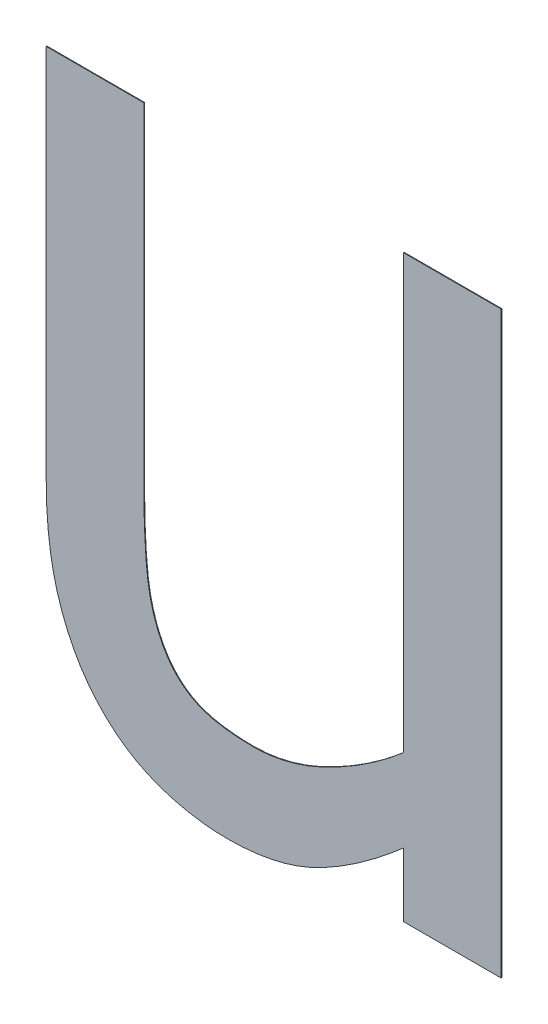
ISO-10303-21;
HEADER;
FILE_DESCRIPTION(('STEP AP214'),'2;1');
FILE_NAME('part.step','',(''),(''),'','','');
FILE_SCHEMA(('AUTOMOTIVE_DESIGN { 1 0 10303 214 1 1 1 1 }'));
ENDSEC;
DATA;
#1=APPLICATION_CONTEXT('core data for automotive mechanical design processes');
#2=APPLICATION_PROTOCOL_DEFINITION('international standard','automotive_design',2000,#1);
#3=PRODUCT_CONTEXT('',#1,'mechanical');
#4=PRODUCT('Part','Part','',(#3));
#5=PRODUCT_RELATED_PRODUCT_CATEGORY('part','',(#4));
#6=PRODUCT_DEFINITION_FORMATION('','',#4);
#7=PRODUCT_DEFINITION_CONTEXT('part definition',#1,'design');
#8=PRODUCT_DEFINITION('design','',#6,#7);
#9=PRODUCT_DEFINITION_SHAPE('','',#8);
#10=(LENGTH_UNIT() NAMED_UNIT(*) SI_UNIT(.MILLI.,.METRE.));
#11=(NAMED_UNIT(*) PLANE_ANGLE_UNIT() SI_UNIT($,.RADIAN.));
#12=(NAMED_UNIT(*) SI_UNIT($,.STERADIAN.) SOLID_ANGLE_UNIT());
#13=UNCERTAINTY_MEASURE_WITH_UNIT(LENGTH_MEASURE(1.E-05),#10,'distance_accuracy_value','');
#14=(GEOMETRIC_REPRESENTATION_CONTEXT(3) GLOBAL_UNCERTAINTY_ASSIGNED_CONTEXT((#13)) GLOBAL_UNIT_ASSIGNED_CONTEXT((#10,
#11,#12)) REPRESENTATION_CONTEXT('',''));
#15=CARTESIAN_POINT('',(0.,0.,0.));
#16=DIRECTION('',(0.,0.,1.));
#17=DIRECTION('',(1.,0.,0.));
#18=AXIS2_PLACEMENT_3D('',#15,#16,#17);
#19=CARTESIAN_POINT('',(-5.79047678036853,4.68413659368605,0.));
#20=DIRECTION('',(-1.,0.,0.));
#21=DIRECTION('',(0.,0.,1.));
#22=AXIS2_PLACEMENT_3D('',#19,#20,#21);
#23=PLANE('',#22);
#24=DIRECTION('',(0.,1.,0.));
#25=VECTOR('',#24,1.);
#26=CARTESIAN_POINT('',(-5.79047678036853,4.63764145522955,0.));
#27=LINE('',#26,#25);
#28=CARTESIAN_POINT('',(-5.79047678036853,4.63764145522955,0.));
#29=VERTEX_POINT('',#28);
#30=CARTESIAN_POINT('',(-5.79047678036853,4.73063173214255,0.));
#31=VERTEX_POINT('',#30);
#32=EDGE_CURVE('E11',#29,#31,#27,.T.);
#33=ORIENTED_EDGE('',*,*,#32,.F.);
#34=DIRECTION('',(0.,0.,1.));
#35=VECTOR('',#34,1.);
#36=CARTESIAN_POINT('',(-5.79047678036853,4.63764145522955,0.));
#37=LINE('',#36,#35);
#38=CARTESIAN_POINT('',(-5.79047678036853,4.63764145522955,0.001));
#39=VERTEX_POINT('',#38);
#40=EDGE_CURVE('E24',#29,#39,#37,.T.);
#41=ORIENTED_EDGE('',*,*,#40,.T.);
#42=DIRECTION('',(0.,-1.,0.));
#43=VECTOR('',#42,1.);
#44=CARTESIAN_POINT('',(-5.79047678036853,4.73063173214255,0.001));
#45=LINE('',#44,#43);
#46=CARTESIAN_POINT('',(-5.79047678036853,4.73063173214255,0.001));
#47=VERTEX_POINT('',#46);
#48=EDGE_CURVE('E136',#47,#39,#45,.T.);
#49=ORIENTED_EDGE('',*,*,#48,.F.);
#50=DIRECTION('',(0.,0.,1.));
#51=VECTOR('',#50,1.);
#52=CARTESIAN_POINT('',(-5.79047678036853,4.73063173214255,0.));
#53=LINE('',#52,#51);
#54=EDGE_CURVE('E282',#31,#47,#53,.T.);
#55=ORIENTED_EDGE('',*,*,#54,.F.);
#56=EDGE_LOOP('',(#33,#41,#49,#55));
#57=FACE_BOUND('',#56,.T.);
#58=ADVANCED_FACE('F17',(#57),#23,.T.);
#59=CARTESIAN_POINT('',(-6.04665587656953,4.61393805131105,0.));
#60=CARTESIAN_POINT('',(-6.04665587656953,4.61393805131105,0.000333333333333333));
#61=CARTESIAN_POINT('',(-6.04665587656953,4.61393805131105,0.000666666666666667));
#62=CARTESIAN_POINT('',(-6.04665587656953,4.61393805131105,0.001));
#63=CARTESIAN_POINT('',(-5.99803350955653,4.61393805131105,0.));
#64=CARTESIAN_POINT('',(-5.99803350955653,4.61393805131105,0.000333333333333333));
#65=CARTESIAN_POINT('',(-5.99803350955653,4.61393805131105,0.000666666666666667));
#66=CARTESIAN_POINT('',(-5.99803350955653,4.61393805131105,0.001));
#67=CARTESIAN_POINT('',(-5.95412143434777,4.62381446961054,0.));
#68=CARTESIAN_POINT('',(-5.95412143434777,4.62381446961054,0.000333333333333333));
#69=CARTESIAN_POINT('',(-5.95412143434777,4.62381446961054,0.000666666666666667));
#70=CARTESIAN_POINT('',(-5.95412143434777,4.62381446961054,0.001));
#71=CARTESIAN_POINT('',(-5.87571786753878,4.66332014280855,0.));
#72=CARTESIAN_POINT('',(-5.87571786753878,4.66332014280855,0.000333333333333333));
#73=CARTESIAN_POINT('',(-5.87571786753878,4.66332014280855,0.000666666666666667));
#74=CARTESIAN_POINT('',(-5.87571786753878,4.66332014280855,0.001));
#75=CARTESIAN_POINT('',(-5.83423691068053,4.69234161811955,0.));
#76=CARTESIAN_POINT('',(-5.83423691068053,4.69234161811955,0.000333333333333333));
#77=CARTESIAN_POINT('',(-5.83423691068053,4.69234161811955,0.000666666666666667));
#78=CARTESIAN_POINT('',(-5.83423691068053,4.69234161811955,0.001));
#79=CARTESIAN_POINT('',(-5.79047678036853,4.73063173214255,0.));
#80=CARTESIAN_POINT('',(-5.79047678036853,4.73063173214255,0.000333333333333333));
#81=CARTESIAN_POINT('',(-5.79047678036853,4.73063173214255,0.000666666666666667));
#82=CARTESIAN_POINT('',(-5.79047678036853,4.73063173214255,0.001));
#83=B_SPLINE_SURFACE_WITH_KNOTS('',3,3,((#59,#60,#61,#62),(#63,#64,#65,#66),(#67,#68,#69,#70),
(#71,#72,#73,#74),(#75,#76,#77,#78),(#79,#80,#81,#82)),.UNSPECIFIED.,.F.,.F.,.F.,(4,2,4),(4,4),
(-2.,-1.,0.),(0.,0.0001),.UNSPECIFIED.);
#84=CARTESIAN_POINT('',(-5.79047678036853,4.73063173214255,0.));
#85=CARTESIAN_POINT('',(-5.85611697583653,4.67319656110805,0.));
#86=CARTESIAN_POINT('',(-5.97372232605003,4.61393805131105,0.));
#87=CARTESIAN_POINT('',(-6.04665587656953,4.61393805131105,0.));
#88=B_SPLINE_CURVE_WITH_KNOTS('',2,(#84,#85,#86,#87),.UNSPECIFIED.,.F.,.F.,(3,1,3),(0.,1.,2.),.UNSPECIFIED.);
#89=CARTESIAN_POINT('',(-6.04665587656953,4.61393805131105,0.));
#90=VERTEX_POINT('',#89);
#91=EDGE_CURVE('E275',#31,#90,#88,.T.);
#92=CARTESIAN_POINT('',(-6.04665587656953,4.61393805131105,0.001));
#93=CARTESIAN_POINT('',(-5.97372232605003,4.61393805131105,0.001));
#94=CARTESIAN_POINT('',(-5.85611697583653,4.67319656110805,0.001));
#95=CARTESIAN_POINT('',(-5.79047678036853,4.73063173214255,0.001));
#96=B_SPLINE_CURVE_WITH_KNOTS('',2,(#92,#93,#94,#95),.UNSPECIFIED.,.F.,.F.,(3,1,3),(-2.,-1.,0.),.UNSPECIFIED.);
#97=CARTESIAN_POINT('',(-6.04665587656953,4.61393805131105,0.001));
#98=VERTEX_POINT('',#97);
#99=EDGE_CURVE('E271',#98,#47,#96,.T.);
#100=DIRECTION('',(0.,0.,1.));
#101=VECTOR('',#100,1.);
#102=CARTESIAN_POINT('',(-6.04665587656953,4.61393805131105,0.));
#103=LINE('',#102,#101);
#104=EDGE_CURVE('E265',#90,#98,#103,.T.);
#105=ORIENTED_EDGE('',*,*,#91,.F.);
#106=ORIENTED_EDGE('',*,*,#54,.T.);
#107=ORIENTED_EDGE('',*,*,#99,.F.);
#108=ORIENTED_EDGE('',*,*,#104,.F.);
#109=EDGE_LOOP('',(#105,#106,#107,#108));
#110=FACE_BOUND('',#109,.T.);
#111=ADVANCED_FACE('F331',(#110),#83,.T.);
#112=CARTESIAN_POINT('',(-6.2344597691568,4.68960660997505,0.));
#113=CARTESIAN_POINT('',(-6.2344597691568,4.68960660997505,0.000333333333333333));
#114=CARTESIAN_POINT('',(-6.2344597691568,4.68960660997505,0.000666666666666667));
#115=CARTESIAN_POINT('',(-6.2344597691568,4.68960660997505,0.001));
#116=CARTESIAN_POINT('',(-6.21075636523795,4.66347208770505,0.));
#117=CARTESIAN_POINT('',(-6.21075636523795,4.66347208770505,0.000333333333333333));
#118=CARTESIAN_POINT('',(-6.21075636523795,4.66347208770505,0.000666666666666667));
#119=CARTESIAN_POINT('',(-6.21075636523795,4.66347208770505,0.001));
#120=CARTESIAN_POINT('',(-6.18264655930845,4.64432703069355,0.));
#121=CARTESIAN_POINT('',(-6.18264655930845,4.64432703069355,0.000333333333333333));
#122=CARTESIAN_POINT('',(-6.18264655930845,4.64432703069355,0.000666666666666667));
#123=CARTESIAN_POINT('',(-6.18264655930845,4.64432703069355,0.001));
#124=CARTESIAN_POINT('',(-6.11761414342811,4.62001584718754,0.));
#125=CARTESIAN_POINT('',(-6.11761414342811,4.62001584718754,0.000333333333333333));
#126=CARTESIAN_POINT('',(-6.11761414342811,4.62001584718754,0.000666666666666666));
#127=CARTESIAN_POINT('',(-6.11761414342811,4.62001584718754,0.001));
#128=CARTESIAN_POINT('',(-6.08312265182853,4.61393805131105,0.));
#129=CARTESIAN_POINT('',(-6.08312265182853,4.61393805131105,0.000333333333333333));
#130=CARTESIAN_POINT('',(-6.08312265182853,4.61393805131105,0.000666666666666667));
#131=CARTESIAN_POINT('',(-6.08312265182853,4.61393805131105,0.001));
#132=CARTESIAN_POINT('',(-6.04665587656953,4.61393805131105,0.));
#133=CARTESIAN_POINT('',(-6.04665587656953,4.61393805131105,0.000333333333333333));
#134=CARTESIAN_POINT('',(-6.04665587656953,4.61393805131105,0.000666666666666667));
#135=CARTESIAN_POINT('',(-6.04665587656953,4.61393805131105,0.001));
#136=B_SPLINE_SURFACE_WITH_KNOTS('',3,3,((#112,#113,#114,#115),(#116,#117,#118,#119),(#120,#121,
#122,#123),(#124,#125,#126,#127),(#128,#129,#130,#131),(#132,#133,#134,#135)),.UNSPECIFIED.,.F.,
.F.,.F.,(4,2,4),(4,4),(-2.,-1.,0.),(0.,0.0001),.UNSPECIFIED.);
#137=CARTESIAN_POINT('',(-6.04665587656953,4.61393805131105,0.));
#138=CARTESIAN_POINT('',(-6.10135603945803,4.61393805131105,0.));
#139=CARTESIAN_POINT('',(-6.19890466327852,4.65040482657005,0.));
#140=CARTESIAN_POINT('',(-6.2344597691568,4.68960660997505,0.));
#141=B_SPLINE_CURVE_WITH_KNOTS('',2,(#137,#138,#139,#140),.UNSPECIFIED.,.F.,.F.,(3,1,3),(0.,1.,
2.),.UNSPECIFIED.);
#142=CARTESIAN_POINT('',(-6.2344597691568,4.68960660997505,0.));
#143=VERTEX_POINT('',#142);
#144=EDGE_CURVE('E258',#90,#143,#141,.T.);
#145=CARTESIAN_POINT('',(-6.2344597691568,4.68960660997505,0.001));
#146=CARTESIAN_POINT('',(-6.19890466327852,4.65040482657005,0.001));
#147=CARTESIAN_POINT('',(-6.10135603945803,4.61393805131105,0.001));
#148=CARTESIAN_POINT('',(-6.04665587656953,4.61393805131105,0.001));
#149=B_SPLINE_CURVE_WITH_KNOTS('',2,(#145,#146,#147,#148),.UNSPECIFIED.,.F.,.F.,(3,1,3),(-2.,
-1.,0.),.UNSPECIFIED.);
#150=CARTESIAN_POINT('',(-6.2344597691568,4.68960660997505,0.001));
#151=VERTEX_POINT('',#150);
#152=EDGE_CURVE('E253',#151,#98,#149,.T.);
#153=DIRECTION('',(0.,0.,1.));
#154=VECTOR('',#153,1.);
#155=CARTESIAN_POINT('',(-6.2344597691568,4.68960660997505,0.));
#156=LINE('',#155,#154);
#157=EDGE_CURVE('E247',#143,#151,#156,.T.);
#158=ORIENTED_EDGE('',*,*,#144,.F.);
#159=ORIENTED_EDGE('',*,*,#104,.T.);
#160=ORIENTED_EDGE('',*,*,#152,.F.);
#161=ORIENTED_EDGE('',*,*,#157,.F.);
#162=EDGE_LOOP('',(#158,#159,#160,#161));
#163=FACE_BOUND('',#162,.T.);
#164=ADVANCED_FACE('F327',(#163),#136,.T.);
#165=CARTESIAN_POINT('',(-6.3110399972023,4.93393400421516,0.));
#166=CARTESIAN_POINT('',(-6.3110399972023,4.93393400421516,0.000333333333333333));
#167=CARTESIAN_POINT('',(-6.3110399972023,4.93393400421516,0.000666666666666667));
#168=CARTESIAN_POINT('',(-6.3110399972023,4.93393400421516,0.001));
#169=CARTESIAN_POINT('',(-6.3110399972023,4.87680272297475,0.));
#170=CARTESIAN_POINT('',(-6.3110399972023,4.87680272297475,0.000333333333333333));
#171=CARTESIAN_POINT('',(-6.3110399972023,4.87680272297475,0.000666666666666667));
#172=CARTESIAN_POINT('',(-6.3110399972023,4.87680272297475,0.001));
#173=CARTESIAN_POINT('',(-6.30435442173801,4.82833230085854,0.));
#174=CARTESIAN_POINT('',(-6.30435442173801,4.82833230085854,0.000333333333333333));
#175=CARTESIAN_POINT('',(-6.30435442173801,4.82833230085854,0.000666666666666667));
#176=CARTESIAN_POINT('',(-6.30435442173801,4.82833230085854,0.001));
#177=CARTESIAN_POINT('',(-6.27761211988085,4.74871317487455,0.));
#178=CARTESIAN_POINT('',(-6.27761211988085,4.74871317487455,0.000333333333333333));
#179=CARTESIAN_POINT('',(-6.27761211988085,4.74871317487455,0.000666666666666667));
#180=CARTESIAN_POINT('',(-6.27761211988085,4.74871317487455,0.001));
#181=CARTESIAN_POINT('',(-6.25877095266331,4.71574113224405,0.));
#182=CARTESIAN_POINT('',(-6.25877095266331,4.71574113224405,0.000333333333333333));
#183=CARTESIAN_POINT('',(-6.25877095266331,4.71574113224405,0.000666666666666667));
#184=CARTESIAN_POINT('',(-6.25877095266331,4.71574113224405,0.001));
#185=CARTESIAN_POINT('',(-6.2344597691568,4.68960660997505,0.));
#186=CARTESIAN_POINT('',(-6.2344597691568,4.68960660997505,0.000333333333333333));
#187=CARTESIAN_POINT('',(-6.2344597691568,4.68960660997505,0.000666666666666667));
#188=CARTESIAN_POINT('',(-6.2344597691568,4.68960660997505,0.001));
#189=B_SPLINE_SURFACE_WITH_KNOTS('',3,3,((#165,#166,#167,#168),(#169,#170,#171,#172),(#173,#174,
#175,#176),(#177,#178,#179,#180),(#181,#182,#183,#184),(#185,#186,#187,#188)),.UNSPECIFIED.,.F.,
.F.,.F.,(4,2,4),(4,4),(-2.,-1.,0.),(0.,0.0001),.UNSPECIFIED.);
#190=CARTESIAN_POINT('',(-6.2344597691568,4.68960660997505,0.));
#191=CARTESIAN_POINT('',(-6.27092654441656,4.72880839337855,0.));
#192=CARTESIAN_POINT('',(-6.3110399972023,4.84823708235455,0.));
#193=CARTESIAN_POINT('',(-6.3110399972023,4.93393400421516,0.));
#194=B_SPLINE_CURVE_WITH_KNOTS('',2,(#190,#191,#192,#193),.UNSPECIFIED.,.F.,.F.,(3,1,3),(0.,1.,
2.),.UNSPECIFIED.);
#195=CARTESIAN_POINT('',(-6.3110399972023,4.93393400421516,0.));
#196=VERTEX_POINT('',#195);
#197=EDGE_CURVE('E240',#143,#196,#194,.T.);
#198=CARTESIAN_POINT('',(-6.3110399972023,4.93393400421516,0.001));
#199=CARTESIAN_POINT('',(-6.3110399972023,4.84823708235455,0.001));
#200=CARTESIAN_POINT('',(-6.27092654441656,4.72880839337855,0.001));
#201=CARTESIAN_POINT('',(-6.2344597691568,4.68960660997505,0.001));
#202=B_SPLINE_CURVE_WITH_KNOTS('',2,(#198,#199,#200,#201),.UNSPECIFIED.,.F.,.F.,(3,1,3),(-2.,
-1.,0.),.UNSPECIFIED.);
#203=CARTESIAN_POINT('',(-6.3110399972023,4.93393400421516,0.001));
#204=VERTEX_POINT('',#203);
#205=EDGE_CURVE('E235',#204,#151,#202,.T.);
#206=DIRECTION('',(0.,0.,1.));
#207=VECTOR('',#206,1.);
#208=CARTESIAN_POINT('',(-6.3110399972023,4.93393400421516,0.));
#209=LINE('',#208,#207);
#210=EDGE_CURVE('E232',#196,#204,#209,.T.);
#211=ORIENTED_EDGE('',*,*,#197,.F.);
#212=ORIENTED_EDGE('',*,*,#157,.T.);
#213=ORIENTED_EDGE('',*,*,#205,.F.);
#214=ORIENTED_EDGE('',*,*,#210,.F.);
#215=EDGE_LOOP('',(#211,#212,#213,#214));
#216=FACE_BOUND('',#215,.T.);
#217=ADVANCED_FACE('F323',(#216),#189,.T.);
#218=CARTESIAN_POINT('',(-6.3110399972023,5.20789065335435,0.));
#219=DIRECTION('',(-1.,0.,0.));
#220=DIRECTION('',(0.,0.,1.));
#221=AXIS2_PLACEMENT_3D('',#218,#219,#220);
#222=PLANE('',#221);
#223=DIRECTION('',(0.,1.,0.));
#224=VECTOR('',#223,1.);
#225=CARTESIAN_POINT('',(-6.3110399972023,4.93393400421516,0.));
#226=LINE('',#225,#224);
#227=CARTESIAN_POINT('',(-6.3110399972023,5.48184730249355,0.));
#228=VERTEX_POINT('',#227);
#229=EDGE_CURVE('E230',#196,#228,#226,.T.);
#230=ORIENTED_EDGE('',*,*,#229,.F.);
#231=ORIENTED_EDGE('',*,*,#210,.T.);
#232=DIRECTION('',(0.,-1.,0.));
#233=VECTOR('',#232,1.);
#234=CARTESIAN_POINT('',(-6.3110399972023,5.48184730249355,0.001));
#235=LINE('',#234,#233);
#236=CARTESIAN_POINT('',(-6.3110399972023,5.48184730249355,0.001));
#237=VERTEX_POINT('',#236);
#238=EDGE_CURVE('E227',#237,#204,#235,.T.);
#239=ORIENTED_EDGE('',*,*,#238,.F.);
#240=DIRECTION('',(0.,0.,1.));
#241=VECTOR('',#240,1.);
#242=CARTESIAN_POINT('',(-6.3110399972023,5.48184730249355,0.));
#243=LINE('',#242,#241);
#244=EDGE_CURVE('E224',#228,#237,#243,.T.);
#245=ORIENTED_EDGE('',*,*,#244,.F.);
#246=EDGE_LOOP('',(#230,#231,#239,#245));
#247=FACE_BOUND('',#246,.T.);
#248=ADVANCED_FACE('F319',(#247),#222,.T.);
#249=CARTESIAN_POINT('',(-6.23992978544576,5.48184730249355,0.));
#250=DIRECTION('',(0.,1.,0.));
#251=DIRECTION('',(0.,0.,1.));
#252=AXIS2_PLACEMENT_3D('',#249,#250,#251);
#253=PLANE('',#252);
#254=DIRECTION('',(1.,0.,0.));
#255=VECTOR('',#254,1.);
#256=CARTESIAN_POINT('',(-6.3110399972023,5.48184730249355,0.));
#257=LINE('',#256,#255);
#258=CARTESIAN_POINT('',(-6.16881957368922,5.48184730249355,0.));
#259=VERTEX_POINT('',#258);
#260=EDGE_CURVE('E222',#228,#259,#257,.T.);
#261=ORIENTED_EDGE('',*,*,#260,.F.);
#262=ORIENTED_EDGE('',*,*,#244,.T.);
#263=DIRECTION('',(-1.,0.,0.));
#264=VECTOR('',#263,1.);
#265=CARTESIAN_POINT('',(-6.16881957368922,5.48184730249355,0.001));
#266=LINE('',#265,#264);
#267=CARTESIAN_POINT('',(-6.16881957368922,5.48184730249355,0.001));
#268=VERTEX_POINT('',#267);
#269=EDGE_CURVE('E219',#268,#237,#266,.T.);
#270=ORIENTED_EDGE('',*,*,#269,.F.);
#271=DIRECTION('',(0.,0.,1.));
#272=VECTOR('',#271,1.);
#273=CARTESIAN_POINT('',(-6.16881957368922,5.48184730249355,0.));
#274=LINE('',#273,#272);
#275=EDGE_CURVE('E216',#259,#268,#274,.T.);
#276=ORIENTED_EDGE('',*,*,#275,.F.);
#277=EDGE_LOOP('',(#261,#262,#270,#276));
#278=FACE_BOUND('',#277,.T.);
#279=ADVANCED_FACE('F315',(#278),#253,.T.);
#280=CARTESIAN_POINT('',(-6.16881957368922,5.24116658577889,0.));
#281=DIRECTION('',(1.,0.,0.));
#282=DIRECTION('',(0.,0.,-1.));
#283=AXIS2_PLACEMENT_3D('',#280,#281,#282);
#284=PLANE('',#283);
#285=DIRECTION('',(0.,-1.,0.));
#286=VECTOR('',#285,1.);
#287=CARTESIAN_POINT('',(-6.16881957368922,5.48184730249355,0.));
#288=LINE('',#287,#286);
#289=CARTESIAN_POINT('',(-6.16881957368922,5.00048586906423,0.));
#290=VERTEX_POINT('',#289);
#291=EDGE_CURVE('E214',#259,#290,#288,.T.);
#292=ORIENTED_EDGE('',*,*,#291,.F.);
#293=ORIENTED_EDGE('',*,*,#275,.T.);
#294=DIRECTION('',(0.,1.,0.));
#295=VECTOR('',#294,1.);
#296=CARTESIAN_POINT('',(-6.16881957368922,5.00048586906423,0.001));
#297=LINE('',#296,#295);
#298=CARTESIAN_POINT('',(-6.16881957368922,5.00048586906423,0.001));
#299=VERTEX_POINT('',#298);
#300=EDGE_CURVE('E211',#299,#268,#297,.T.);
#301=ORIENTED_EDGE('',*,*,#300,.F.);
#302=DIRECTION('',(0.,0.,1.));
#303=VECTOR('',#302,1.);
#304=CARTESIAN_POINT('',(-6.16881957368922,5.00048586906423,0.));
#305=LINE('',#304,#303);
#306=EDGE_CURVE('E205',#290,#299,#305,.T.);
#307=ORIENTED_EDGE('',*,*,#306,.F.);
#308=EDGE_LOOP('',(#292,#293,#301,#307));
#309=FACE_BOUND('',#308,.T.);
#310=ADVANCED_FACE('F311',(#309),#284,.T.);
#311=CARTESIAN_POINT('',(-6.14146949224503,4.81177030709555,0.));
#312=CARTESIAN_POINT('',(-6.14146949224503,4.81177030709555,0.000333333333333333));
#313=CARTESIAN_POINT('',(-6.14146949224503,4.81177030709555,0.000666666666666667));
#314=CARTESIAN_POINT('',(-6.14146949224503,4.81177030709555,0.001));
#315=CARTESIAN_POINT('',(-6.15301730441003,4.83365037225055,0.));
#316=CARTESIAN_POINT('',(-6.15301730441003,4.83365037225055,0.000333333333333333));
#317=CARTESIAN_POINT('',(-6.15301730441003,4.83365037225055,0.000666666666666667));
#318=CARTESIAN_POINT('',(-6.15301730441003,4.83365037225055,0.001));
#319=CARTESIAN_POINT('',(-6.16046260435864,4.85932905982898,0.));
#320=CARTESIAN_POINT('',(-6.16046260435864,4.85932905982898,0.000333333333333333));
#321=CARTESIAN_POINT('',(-6.16046260435864,4.85932905982898,0.000666666666666667));
#322=CARTESIAN_POINT('',(-6.16046260435864,4.85932905982898,0.001));
#323=CARTESIAN_POINT('',(-6.1671481798231,4.91828367983273,0.));
#324=CARTESIAN_POINT('',(-6.1671481798231,4.91828367983273,0.000333333333333333));
#325=CARTESIAN_POINT('',(-6.1671481798231,4.91828367983273,0.000666666666666667));
#326=CARTESIAN_POINT('',(-6.1671481798231,4.91828367983273,0.001));
#327=CARTESIAN_POINT('',(-6.16881957368922,4.95551017957719,0.));
#328=CARTESIAN_POINT('',(-6.16881957368922,4.95551017957719,0.000333333333333333));
#329=CARTESIAN_POINT('',(-6.16881957368922,4.95551017957719,0.000666666666666667));
#330=CARTESIAN_POINT('',(-6.16881957368922,4.95551017957719,0.001));
#331=CARTESIAN_POINT('',(-6.16881957368922,5.00048586906423,0.));
#332=CARTESIAN_POINT('',(-6.16881957368922,5.00048586906423,0.000333333333333333));
#333=CARTESIAN_POINT('',(-6.16881957368922,5.00048586906423,0.000666666666666667));
#334=CARTESIAN_POINT('',(-6.16881957368922,5.00048586906423,0.001));
#335=B_SPLINE_SURFACE_WITH_KNOTS('',3,3,((#311,#312,#313,#314),(#315,#316,#317,#318),(#319,#320,
#321,#322),(#323,#324,#325,#326),(#327,#328,#329,#330),(#331,#332,#333,#334)),.UNSPECIFIED.,.F.,
.F.,.F.,(4,2,4),(4,4),(-2.,-1.,0.),(0.,0.0001),.UNSPECIFIED.);
#336=CARTESIAN_POINT('',(-6.16881957368922,5.00048586906423,0.));
#337=CARTESIAN_POINT('',(-6.16881957368922,4.93302233483367,0.));
#338=CARTESIAN_POINT('',(-6.15879121049253,4.84459040482805,0.));
#339=CARTESIAN_POINT('',(-6.14146949224503,4.81177030709555,0.));
#340=B_SPLINE_CURVE_WITH_KNOTS('',2,(#336,#337,#338,#339),.UNSPECIFIED.,.F.,.F.,(3,1,3),(0.,1.,
2.),.UNSPECIFIED.);
#341=CARTESIAN_POINT('',(-6.14146949224503,4.81177030709555,0.));
#342=VERTEX_POINT('',#341);
#343=EDGE_CURVE('E198',#290,#342,#340,.T.);
#344=CARTESIAN_POINT('',(-6.14146949224503,4.81177030709555,0.001));
#345=CARTESIAN_POINT('',(-6.15879121049253,4.84459040482805,0.001));
#346=CARTESIAN_POINT('',(-6.16881957368922,4.93302233483367,0.001));
#347=CARTESIAN_POINT('',(-6.16881957368922,5.00048586906423,0.001));
#348=B_SPLINE_CURVE_WITH_KNOTS('',2,(#344,#345,#346,#347),.UNSPECIFIED.,.F.,.F.,(3,1,3),(-2.,
-1.,0.),.UNSPECIFIED.);
#349=CARTESIAN_POINT('',(-6.14146949224503,4.81177030709555,0.001));
#350=VERTEX_POINT('',#349);
#351=EDGE_CURVE('E193',#350,#299,#348,.T.);
#352=DIRECTION('',(0.,0.,1.));
#353=VECTOR('',#352,1.);
#354=CARTESIAN_POINT('',(-6.14146949224503,4.81177030709555,0.));
#355=LINE('',#354,#353);
#356=EDGE_CURVE('E187',#342,#350,#355,.T.);
#357=ORIENTED_EDGE('',*,*,#343,.F.);
#358=ORIENTED_EDGE('',*,*,#306,.T.);
#359=ORIENTED_EDGE('',*,*,#351,.F.);
#360=ORIENTED_EDGE('',*,*,#356,.F.);
#361=EDGE_LOOP('',(#357,#358,#359,#360));
#362=FACE_BOUND('',#361,.T.);
#363=ADVANCED_FACE('F307',(#362),#335,.T.);
#364=CARTESIAN_POINT('',(-6.00927743192703,4.74886511977205,0.));
#365=CARTESIAN_POINT('',(-6.00927743192703,4.74886511977205,0.000333333333333333));
#366=CARTESIAN_POINT('',(-6.00927743192703,4.74886511977205,0.000666666666666667));
#367=CARTESIAN_POINT('',(-6.00927743192703,4.74886511977205,0.001));
#368=CARTESIAN_POINT('',(-6.04635198677503,4.74886511977205,0.));
#369=CARTESIAN_POINT('',(-6.04635198677503,4.74886511977205,0.000333333333333333));
#370=CARTESIAN_POINT('',(-6.04635198677503,4.74886511977205,0.000666666666666667));
#371=CARTESIAN_POINT('',(-6.04635198677503,4.74886511977205,0.001));
#372=CARTESIAN_POINT('',(-6.07476568249853,4.7538793013703,0.));
#373=CARTESIAN_POINT('',(-6.07476568249853,4.7538793013703,0.000333333333333333));
#374=CARTESIAN_POINT('',(-6.07476568249853,4.7538793013703,0.000666666666666667));
#375=CARTESIAN_POINT('',(-6.07476568249853,4.7538793013703,0.001));
#376=CARTESIAN_POINT('',(-6.11427135569653,4.7739360277633,0.));
#377=CARTESIAN_POINT('',(-6.11427135569653,4.7739360277633,0.000333333333333333));
#378=CARTESIAN_POINT('',(-6.11427135569653,4.7739360277633,0.000666666666666667));
#379=CARTESIAN_POINT('',(-6.11427135569653,4.7739360277633,0.001));
#380=CARTESIAN_POINT('',(-6.12992168007903,4.78989024193955,0.));
#381=CARTESIAN_POINT('',(-6.12992168007903,4.78989024193955,0.000333333333333333));
#382=CARTESIAN_POINT('',(-6.12992168007903,4.78989024193955,0.000666666666666667));
#383=CARTESIAN_POINT('',(-6.12992168007903,4.78989024193955,0.001));
#384=CARTESIAN_POINT('',(-6.14146949224503,4.81177030709555,0.));
#385=CARTESIAN_POINT('',(-6.14146949224503,4.81177030709555,0.000333333333333333));
#386=CARTESIAN_POINT('',(-6.14146949224503,4.81177030709555,0.000666666666666667));
#387=CARTESIAN_POINT('',(-6.14146949224503,4.81177030709555,0.001));
#388=B_SPLINE_SURFACE_WITH_KNOTS('',3,3,((#364,#365,#366,#367),(#368,#369,#370,#371),(#372,#373,
#374,#375),(#376,#377,#378,#379),(#380,#381,#382,#383),(#384,#385,#386,#387)),.UNSPECIFIED.,.F.,
.F.,.F.,(4,2,4),(4,4),(-2.,-1.,0.),(0.,0.0001),.UNSPECIFIED.);
#389=CARTESIAN_POINT('',(-6.14146949224503,4.81177030709555,0.));
#390=CARTESIAN_POINT('',(-6.12414777399603,4.77895020936155,0.));
#391=CARTESIAN_POINT('',(-6.06488926419903,4.74886511977205,0.));
#392=CARTESIAN_POINT('',(-6.00927743192703,4.74886511977205,0.));
#393=B_SPLINE_CURVE_WITH_KNOTS('',2,(#389,#390,#391,#392),.UNSPECIFIED.,.F.,.F.,(3,1,3),(0.,1.,
2.),.UNSPECIFIED.);
#394=CARTESIAN_POINT('',(-6.00927743192703,4.74886511977205,0.));
#395=VERTEX_POINT('',#394);
#396=EDGE_CURVE('E180',#342,#395,#393,.T.);
#397=CARTESIAN_POINT('',(-6.00927743192703,4.74886511977205,0.001));
#398=CARTESIAN_POINT('',(-6.06488926419903,4.74886511977205,0.001));
#399=CARTESIAN_POINT('',(-6.12414777399603,4.77895020936155,0.001));
#400=CARTESIAN_POINT('',(-6.14146949224503,4.81177030709555,0.001));
#401=B_SPLINE_CURVE_WITH_KNOTS('',2,(#397,#398,#399,#400),.UNSPECIFIED.,.F.,.F.,(3,1,3),(-2.,
-1.,0.),.UNSPECIFIED.);
#402=CARTESIAN_POINT('',(-6.00927743192703,4.74886511977205,0.001));
#403=VERTEX_POINT('',#402);
#404=EDGE_CURVE('E175',#403,#350,#401,.T.);
#405=DIRECTION('',(0.,0.,1.));
#406=VECTOR('',#405,1.);
#407=CARTESIAN_POINT('',(-6.00927743192703,4.74886511977205,0.));
#408=LINE('',#407,#406);
#409=EDGE_CURVE('E169',#395,#403,#408,.T.);
#410=ORIENTED_EDGE('',*,*,#396,.F.);
#411=ORIENTED_EDGE('',*,*,#356,.T.);
#412=ORIENTED_EDGE('',*,*,#404,.F.);
#413=ORIENTED_EDGE('',*,*,#409,.F.);
#414=EDGE_LOOP('',(#410,#411,#412,#413));
#415=FACE_BOUND('',#414,.T.);
#416=ADVANCED_FACE('F303',(#415),#388,.T.);
#417=CARTESIAN_POINT('',(-5.79047678036853,4.85097209049905,0.));
#418=CARTESIAN_POINT('',(-5.79047678036853,4.85097209049905,0.000333333333333333));
#419=CARTESIAN_POINT('',(-5.79047678036853,4.85097209049905,0.000666666666666667));
#420=CARTESIAN_POINT('',(-5.79047678036853,4.85097209049905,0.001));
#421=CARTESIAN_POINT('',(-5.82329687810253,4.82240644987905,0.));
#422=CARTESIAN_POINT('',(-5.82329687810253,4.82240644987905,0.000333333333333333));
#423=CARTESIAN_POINT('',(-5.82329687810253,4.82240644987905,0.000666666666666667));
#424=CARTESIAN_POINT('',(-5.82329687810253,4.82240644987905,0.001));
#425=CARTESIAN_POINT('',(-5.85930781867178,4.79824721126954,0.));
#426=CARTESIAN_POINT('',(-5.85930781867178,4.79824721126954,0.000333333333333333));
#427=CARTESIAN_POINT('',(-5.85930781867178,4.79824721126954,0.000666666666666667));
#428=CARTESIAN_POINT('',(-5.85930781867178,4.79824721126954,0.001));
#429=CARTESIAN_POINT('',(-5.93771138548078,4.75874153807155,0.));
#430=CARTESIAN_POINT('',(-5.93771138548078,4.75874153807155,0.000333333333333333));
#431=CARTESIAN_POINT('',(-5.93771138548078,4.75874153807155,0.000666666666666667));
#432=CARTESIAN_POINT('',(-5.93771138548078,4.75874153807155,0.001));
#433=CARTESIAN_POINT('',(-5.97463399543103,4.74886511977205,0.));
#434=CARTESIAN_POINT('',(-5.97463399543103,4.74886511977205,0.000333333333333333));
#435=CARTESIAN_POINT('',(-5.97463399543103,4.74886511977205,0.000666666666666667));
#436=CARTESIAN_POINT('',(-5.97463399543103,4.74886511977205,0.001));
#437=CARTESIAN_POINT('',(-6.00927743192703,4.74886511977205,0.));
#438=CARTESIAN_POINT('',(-6.00927743192703,4.74886511977205,0.000333333333333333));
#439=CARTESIAN_POINT('',(-6.00927743192703,4.74886511977205,0.000666666666666667));
#440=CARTESIAN_POINT('',(-6.00927743192703,4.74886511977205,0.001));
#441=B_SPLINE_SURFACE_WITH_KNOTS('',3,3,((#417,#418,#419,#420),(#421,#422,#423,#424),(#425,#426,
#427,#428),(#429,#430,#431,#432),(#433,#434,#435,#436),(#437,#438,#439,#440)),.UNSPECIFIED.,.F.,
.F.,.F.,(4,2,4),(4,4),(-2.,-1.,0.),(0.,0.0001),.UNSPECIFIED.);
#442=CARTESIAN_POINT('',(-6.00927743192703,4.74886511977205,0.));
#443=CARTESIAN_POINT('',(-5.95731227718303,4.74886511977205,0.));
#444=CARTESIAN_POINT('',(-5.83970692696953,4.80812362956905,0.));
#445=CARTESIAN_POINT('',(-5.79047678036853,4.85097209049905,0.));
#446=B_SPLINE_CURVE_WITH_KNOTS('',2,(#442,#443,#444,#445),.UNSPECIFIED.,.F.,.F.,(3,1,3),(0.,1.,
2.),.UNSPECIFIED.);
#447=CARTESIAN_POINT('',(-5.79047678036853,4.85097209049905,0.));
#448=VERTEX_POINT('',#447);
#449=EDGE_CURVE('E162',#395,#448,#446,.T.);
#450=CARTESIAN_POINT('',(-5.79047678036853,4.85097209049905,0.001));
#451=CARTESIAN_POINT('',(-5.83970692696953,4.80812362956905,0.001));
#452=CARTESIAN_POINT('',(-5.95731227718303,4.74886511977205,0.001));
#453=CARTESIAN_POINT('',(-6.00927743192703,4.74886511977205,0.001));
#454=B_SPLINE_CURVE_WITH_KNOTS('',2,(#450,#451,#452,#453),.UNSPECIFIED.,.F.,.F.,(3,1,3),(-2.,
-1.,0.),.UNSPECIFIED.);
#455=CARTESIAN_POINT('',(-5.79047678036853,4.85097209049905,0.001));
#456=VERTEX_POINT('',#455);
#457=EDGE_CURVE('E157',#456,#403,#454,.T.);
#458=DIRECTION('',(0.,0.,1.));
#459=VECTOR('',#458,1.);
#460=CARTESIAN_POINT('',(-5.79047678036853,4.85097209049905,0.));
#461=LINE('',#460,#459);
#462=EDGE_CURVE('E154',#448,#456,#461,.T.);
#463=ORIENTED_EDGE('',*,*,#449,.F.);
#464=ORIENTED_EDGE('',*,*,#409,.T.);
#465=ORIENTED_EDGE('',*,*,#457,.F.);
#466=ORIENTED_EDGE('',*,*,#462,.F.);
#467=EDGE_LOOP('',(#463,#464,#465,#466));
#468=FACE_BOUND('',#467,.T.);
#469=ADVANCED_FACE('F299',(#468),#441,.T.);
#470=CARTESIAN_POINT('',(-5.79047678036853,5.1664096964963,0.));
#471=DIRECTION('',(-1.,0.,0.));
#472=DIRECTION('',(0.,0.,1.));
#473=AXIS2_PLACEMENT_3D('',#470,#471,#472);
#474=PLANE('',#473);
#475=DIRECTION('',(0.,1.,0.));
#476=VECTOR('',#475,1.);
#477=CARTESIAN_POINT('',(-5.79047678036853,4.85097209049905,0.));
#478=LINE('',#477,#476);
#479=CARTESIAN_POINT('',(-5.79047678036853,5.48184730249355,0.));
#480=VERTEX_POINT('',#479);
#481=EDGE_CURVE('E152',#448,#480,#478,.T.);
#482=ORIENTED_EDGE('',*,*,#481,.F.);
#483=ORIENTED_EDGE('',*,*,#462,.T.);
#484=DIRECTION('',(0.,-1.,0.));
#485=VECTOR('',#484,1.);
#486=CARTESIAN_POINT('',(-5.79047678036853,5.48184730249355,0.001));
#487=LINE('',#486,#485);
#488=CARTESIAN_POINT('',(-5.79047678036853,5.48184730249355,0.001));
#489=VERTEX_POINT('',#488);
#490=EDGE_CURVE('E149',#489,#456,#487,.T.);
#491=ORIENTED_EDGE('',*,*,#490,.F.);
#492=DIRECTION('',(0.,0.,1.));
#493=VECTOR('',#492,1.);
#494=CARTESIAN_POINT('',(-5.79047678036853,5.48184730249355,0.));
#495=LINE('',#494,#493);
#496=EDGE_CURVE('E146',#480,#489,#495,.T.);
#497=ORIENTED_EDGE('',*,*,#496,.F.);
#498=EDGE_LOOP('',(#482,#483,#491,#497));
#499=FACE_BOUND('',#498,.T.);
#500=ADVANCED_FACE('F295',(#499),#474,.T.);
#501=CARTESIAN_POINT('',(-5.71936656861228,5.48184730249355,0.));
#502=DIRECTION('',(0.,1.,0.));
#503=DIRECTION('',(0.,0.,1.));
#504=AXIS2_PLACEMENT_3D('',#501,#502,#503);
#505=PLANE('',#504);
#506=DIRECTION('',(1.,0.,0.));
#507=VECTOR('',#506,1.);
#508=CARTESIAN_POINT('',(-5.79047678036853,5.48184730249355,0.));
#509=LINE('',#508,#507);
#510=CARTESIAN_POINT('',(-5.64825635685603,5.48184730249355,0.));
#511=VERTEX_POINT('',#510);
#512=EDGE_CURVE('E144',#480,#511,#509,.T.);
#513=ORIENTED_EDGE('',*,*,#512,.F.);
#514=ORIENTED_EDGE('',*,*,#496,.T.);
#515=DIRECTION('',(-1.,0.,0.));
#516=VECTOR('',#515,1.);
#517=CARTESIAN_POINT('',(-5.64825635685603,5.48184730249355,0.001));
#518=LINE('',#517,#516);
#519=CARTESIAN_POINT('',(-5.64825635685603,5.48184730249355,0.001));
#520=VERTEX_POINT('',#519);
#521=EDGE_CURVE('E142',#520,#489,#518,.T.);
#522=ORIENTED_EDGE('',*,*,#521,.F.);
#523=DIRECTION('',(0.,0.,1.));
#524=VECTOR('',#523,1.);
#525=CARTESIAN_POINT('',(-5.64825635685603,5.48184730249355,0.));
#526=LINE('',#525,#524);
#527=EDGE_CURVE('E121',#511,#520,#526,.T.);
#528=ORIENTED_EDGE('',*,*,#527,.F.);
#529=EDGE_LOOP('',(#513,#514,#522,#528));
#530=FACE_BOUND('',#529,.T.);
#531=ADVANCED_FACE('F293',(#530),#505,.T.);
#532=CARTESIAN_POINT('',(-5.64825635685603,5.05974437886155,0.));
#533=DIRECTION('',(1.,0.,0.));
#534=DIRECTION('',(0.,0.,-1.));
#535=AXIS2_PLACEMENT_3D('',#532,#533,#534);
#536=PLANE('',#535);
#537=DIRECTION('',(0.,-1.,0.));
#538=VECTOR('',#537,1.);
#539=CARTESIAN_POINT('',(-5.64825635685603,5.48184730249355,0.));
#540=LINE('',#539,#538);
#541=CARTESIAN_POINT('',(-5.64825635685603,4.63764145522955,0.));
#542=VERTEX_POINT('',#541);
#543=EDGE_CURVE('E125',#511,#542,#540,.T.);
#544=ORIENTED_EDGE('',*,*,#543,.F.);
#545=ORIENTED_EDGE('',*,*,#527,.T.);
#546=DIRECTION('',(0.,1.,0.));
#547=VECTOR('',#546,1.);
#548=CARTESIAN_POINT('',(-5.64825635685603,4.63764145522955,0.001));
#549=LINE('',#548,#547);
#550=CARTESIAN_POINT('',(-5.64825635685603,4.63764145522955,0.001));
#551=VERTEX_POINT('',#550);
#552=EDGE_CURVE('E114',#551,#520,#549,.T.);
#553=ORIENTED_EDGE('',*,*,#552,.F.);
#554=DIRECTION('',(0.,0.,1.));
#555=VECTOR('',#554,1.);
#556=CARTESIAN_POINT('',(-5.64825635685603,4.63764145522955,0.));
#557=LINE('',#556,#555);
#558=EDGE_CURVE('E118',#542,#551,#557,.T.);
#559=ORIENTED_EDGE('',*,*,#558,.F.);
#560=EDGE_LOOP('',(#544,#545,#553,#559));
#561=FACE_BOUND('',#560,.T.);
#562=ADVANCED_FACE('F117',(#561),#536,.T.);
#563=CARTESIAN_POINT('',(-5.71936656861228,4.63764145522955,0.));
#564=DIRECTION('',(0.,-1.,0.));
#565=DIRECTION('',(0.,0.,-1.));
#566=AXIS2_PLACEMENT_3D('',#563,#564,#565);
#567=PLANE('',#566);
#568=DIRECTION('',(-1.,0.,0.));
#569=VECTOR('',#568,1.);
#570=CARTESIAN_POINT('',(-5.64825635685603,4.63764145522955,0.));
#571=LINE('',#570,#569);
#572=EDGE_CURVE('E131',#542,#29,#571,.T.);
#573=ORIENTED_EDGE('',*,*,#572,.F.);
#574=ORIENTED_EDGE('',*,*,#558,.T.);
#575=DIRECTION('',(1.,0.,0.));
#576=VECTOR('',#575,1.);
#577=CARTESIAN_POINT('',(-5.79047678036853,4.63764145522955,0.001));
#578=LINE('',#577,#576);
#579=EDGE_CURVE('E130',#39,#551,#578,.T.);
#580=ORIENTED_EDGE('',*,*,#579,.F.);
#581=ORIENTED_EDGE('',*,*,#40,.F.);
#582=EDGE_LOOP('',(#573,#574,#580,#581));
#583=FACE_BOUND('',#582,.T.);
#584=ADVANCED_FACE('F129',(#583),#567,.T.);
#585=CARTESIAN_POINT('',(-5.97964817702917,4.61393805131105,0.));
#586=DIRECTION('',(0.,0.,1.));
#587=DIRECTION('',(1.,0.,0.));
#588=AXIS2_PLACEMENT_3D('',#585,#586,#587);
#589=PLANE('',#588);
#590=ORIENTED_EDGE('',*,*,#572,.T.);
#591=ORIENTED_EDGE('',*,*,#32,.T.);
#592=ORIENTED_EDGE('',*,*,#91,.T.);
#593=ORIENTED_EDGE('',*,*,#144,.T.);
#594=ORIENTED_EDGE('',*,*,#197,.T.);
#595=ORIENTED_EDGE('',*,*,#229,.T.);
#596=ORIENTED_EDGE('',*,*,#260,.T.);
#597=ORIENTED_EDGE('',*,*,#291,.T.);
#598=ORIENTED_EDGE('',*,*,#343,.T.);
#599=ORIENTED_EDGE('',*,*,#396,.T.);
#600=ORIENTED_EDGE('',*,*,#449,.T.);
#601=ORIENTED_EDGE('',*,*,#481,.T.);
#602=ORIENTED_EDGE('',*,*,#512,.T.);
#603=ORIENTED_EDGE('',*,*,#543,.T.);
#604=EDGE_LOOP('',(#590,#591,#592,#593,#594,#595,#596,#597,#598,#599,#600,#601,#602,#603));
#605=FACE_BOUND('',#604,.T.);
#606=ADVANCED_FACE('F288',(#605),#589,.F.);
#607=CARTESIAN_POINT('',(-5.97964817702917,4.61393805131105,0.001));
#608=DIRECTION('',(0.,0.,1.));
#609=DIRECTION('',(1.,0.,0.));
#610=AXIS2_PLACEMENT_3D('',#607,#608,#609);
#611=PLANE('',#610);
#612=ORIENTED_EDGE('',*,*,#579,.T.);
#613=ORIENTED_EDGE('',*,*,#552,.T.);
#614=ORIENTED_EDGE('',*,*,#521,.T.);
#615=ORIENTED_EDGE('',*,*,#490,.T.);
#616=ORIENTED_EDGE('',*,*,#457,.T.);
#617=ORIENTED_EDGE('',*,*,#404,.T.);
#618=ORIENTED_EDGE('',*,*,#351,.T.);
#619=ORIENTED_EDGE('',*,*,#300,.T.);
#620=ORIENTED_EDGE('',*,*,#269,.T.);
#621=ORIENTED_EDGE('',*,*,#238,.T.);
#622=ORIENTED_EDGE('',*,*,#205,.T.);
#623=ORIENTED_EDGE('',*,*,#152,.T.);
#624=ORIENTED_EDGE('',*,*,#99,.T.);
#625=ORIENTED_EDGE('',*,*,#48,.T.);
#626=EDGE_LOOP('',(#612,#613,#614,#615,#616,#617,#618,#619,#620,#621,#622,#623,#624,#625));
#627=FACE_BOUND('',#626,.T.);
#628=ADVANCED_FACE('F134',(#627),#611,.T.);
#629=CLOSED_SHELL('',(#58,#111,#164,#217,#248,#279,#310,#363,#416,#469,#500,#531,#562,#584,#606,#628));
#630=MANIFOLD_SOLID_BREP('B1',#629);
#631=ADVANCED_BREP_SHAPE_REPRESENTATION('',(#18,#630),#14);
#632=SHAPE_DEFINITION_REPRESENTATION(#9,#631);
ENDSEC;
END-ISO-10303-21;
